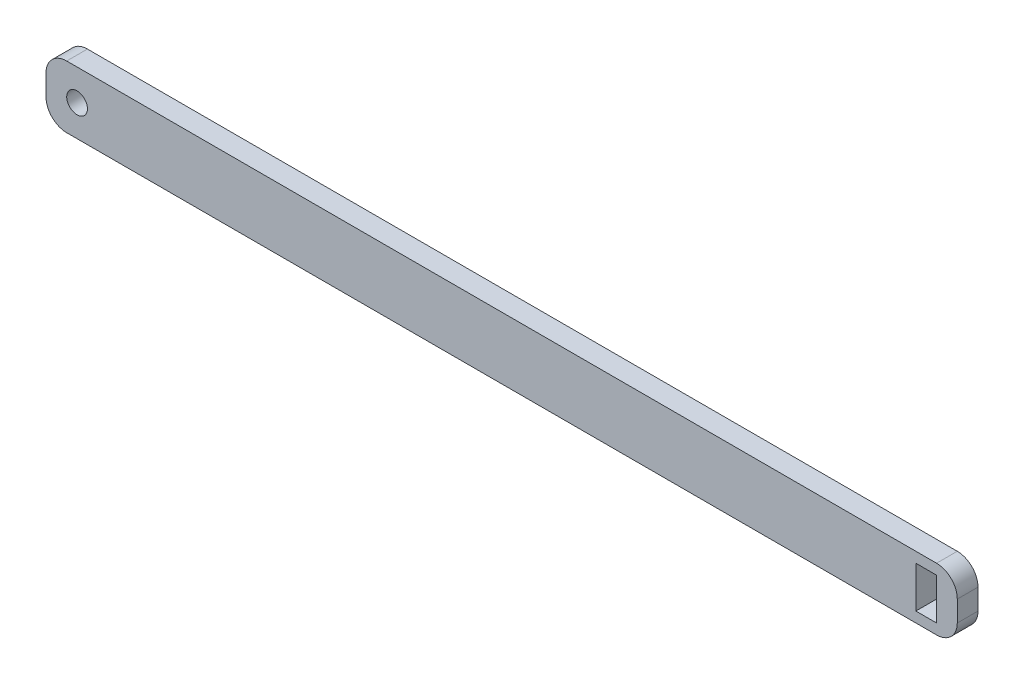
ISO-10303-21;
HEADER;
FILE_DESCRIPTION(('STEP AP214'),'2;1');
FILE_NAME('part.step','',(''),(''),'','','');
FILE_SCHEMA(('AUTOMOTIVE_DESIGN { 1 0 10303 214 1 1 1 1 }'));
ENDSEC;
DATA;
#1=APPLICATION_CONTEXT('core data for automotive mechanical design processes');
#2=APPLICATION_PROTOCOL_DEFINITION('international standard','automotive_design',2000,#1);
#3=PRODUCT_CONTEXT('',#1,'mechanical');
#4=PRODUCT('Part','Part','',(#3));
#5=PRODUCT_RELATED_PRODUCT_CATEGORY('part','',(#4));
#6=PRODUCT_DEFINITION_FORMATION('','',#4);
#7=PRODUCT_DEFINITION_CONTEXT('part definition',#1,'design');
#8=PRODUCT_DEFINITION('design','',#6,#7);
#9=PRODUCT_DEFINITION_SHAPE('','',#8);
#10=(LENGTH_UNIT() NAMED_UNIT(*) SI_UNIT(.MILLI.,.METRE.));
#11=(NAMED_UNIT(*) PLANE_ANGLE_UNIT() SI_UNIT($,.RADIAN.));
#12=(NAMED_UNIT(*) SI_UNIT($,.STERADIAN.) SOLID_ANGLE_UNIT());
#13=UNCERTAINTY_MEASURE_WITH_UNIT(LENGTH_MEASURE(1.E-05),#10,'distance_accuracy_value','');
#14=(GEOMETRIC_REPRESENTATION_CONTEXT(3) GLOBAL_UNCERTAINTY_ASSIGNED_CONTEXT((#13)) GLOBAL_UNIT_ASSIGNED_CONTEXT((#10,
#11,#12)) REPRESENTATION_CONTEXT('',''));
#15=CARTESIAN_POINT('',(0.,0.,0.));
#16=DIRECTION('',(0.,0.,1.));
#17=DIRECTION('',(1.,0.,0.));
#18=AXIS2_PLACEMENT_3D('',#15,#16,#17);
#19=CARTESIAN_POINT('',(-215.,5.,5.));
#20=DIRECTION('',(0.,0.,1.));
#21=DIRECTION('',(1.,0.,0.));
#22=AXIS2_PLACEMENT_3D('',#19,#20,#21);
#23=PLANE('',#22);
#24=DIRECTION('',(1.,0.,0.));
#25=VECTOR('',#24,1.);
#26=CARTESIAN_POINT('',(-10.,2.5,5.));
#27=LINE('',#26,#25);
#28=CARTESIAN_POINT('',(-10.,2.5,5.));
#29=VERTEX_POINT('',#28);
#30=CARTESIAN_POINT('',(-5.00000000000001,2.5,5.));
#31=VERTEX_POINT('',#30);
#32=EDGE_CURVE('E132',#29,#31,#27,.T.);
#33=ORIENTED_EDGE('',*,*,#32,.F.);
#34=DIRECTION('',(0.,-1.,0.));
#35=VECTOR('',#34,1.);
#36=CARTESIAN_POINT('',(-10.,12.5,5.));
#37=LINE('',#36,#35);
#38=CARTESIAN_POINT('',(-10.,12.5,5.));
#39=VERTEX_POINT('',#38);
#40=EDGE_CURVE('E124',#39,#29,#37,.T.);
#41=ORIENTED_EDGE('',*,*,#40,.F.);
#42=DIRECTION('',(-1.,0.,0.));
#43=VECTOR('',#42,1.);
#44=CARTESIAN_POINT('',(-10.,12.5,5.));
#45=LINE('',#44,#43);
#46=CARTESIAN_POINT('',(-5.,12.5,5.));
#47=VERTEX_POINT('',#46);
#48=EDGE_CURVE('E147',#47,#39,#45,.T.);
#49=ORIENTED_EDGE('',*,*,#48,.F.);
#50=DIRECTION('',(0.,1.,0.));
#51=VECTOR('',#50,1.);
#52=CARTESIAN_POINT('',(-5.00000000000001,12.5,5.));
#53=LINE('',#52,#51);
#54=EDGE_CURVE('E145',#31,#47,#53,.T.);
#55=ORIENTED_EDGE('',*,*,#54,.F.);
#56=EDGE_LOOP('',(#33,#41,#49,#55));
#57=FACE_BOUND('',#56,.T.);
#58=CARTESIAN_POINT('',(-215.,5.,5.));
#59=DIRECTION('',(0.,0.,1.));
#60=DIRECTION('',(1.,0.,0.));
#61=AXIS2_PLACEMENT_3D('',#58,#59,#60);
#62=CIRCLE('',#61,5.);
#63=CARTESIAN_POINT('',(-220.,5.00000000000004,5.));
#64=VERTEX_POINT('',#63);
#65=CARTESIAN_POINT('',(-215.,0.,5.));
#66=VERTEX_POINT('',#65);
#67=EDGE_CURVE('E163',#64,#66,#62,.T.);
#68=ORIENTED_EDGE('',*,*,#67,.T.);
#69=DIRECTION('',(1.,0.,0.));
#70=VECTOR('',#69,1.);
#71=CARTESIAN_POINT('',(-215.,0.,5.));
#72=LINE('',#71,#70);
#73=CARTESIAN_POINT('',(-5.00000000000005,0.,5.));
#74=VERTEX_POINT('',#73);
#75=EDGE_CURVE('E166',#66,#74,#72,.T.);
#76=ORIENTED_EDGE('',*,*,#75,.T.);
#77=CARTESIAN_POINT('',(-5.00000000000001,5.,5.));
#78=DIRECTION('',(0.,0.,1.));
#79=DIRECTION('',(1.,0.,0.));
#80=AXIS2_PLACEMENT_3D('',#77,#78,#79);
#81=CIRCLE('',#80,5.);
#82=CARTESIAN_POINT('',(0.,5.00000000000004,5.));
#83=VERTEX_POINT('',#82);
#84=EDGE_CURVE('E169',#74,#83,#81,.T.);
#85=ORIENTED_EDGE('',*,*,#84,.T.);
#86=DIRECTION('',(0.,1.,0.));
#87=VECTOR('',#86,1.);
#88=CARTESIAN_POINT('',(0.,10.,5.));
#89=LINE('',#88,#87);
#90=CARTESIAN_POINT('',(0.,10.,5.));
#91=VERTEX_POINT('',#90);
#92=EDGE_CURVE('E171',#83,#91,#89,.T.);
#93=ORIENTED_EDGE('',*,*,#92,.T.);
#94=CARTESIAN_POINT('',(-5.00000000000002,10.,5.));
#95=DIRECTION('',(0.,0.,1.));
#96=DIRECTION('',(-1.,0.,0.));
#97=AXIS2_PLACEMENT_3D('',#94,#95,#96);
#98=CIRCLE('',#97,5.);
#99=CARTESIAN_POINT('',(-5.00000000000005,15.,5.));
#100=VERTEX_POINT('',#99);
#101=EDGE_CURVE('E173',#91,#100,#98,.T.);
#102=ORIENTED_EDGE('',*,*,#101,.T.);
#103=DIRECTION('',(-1.,0.,0.));
#104=VECTOR('',#103,1.);
#105=CARTESIAN_POINT('',(-215.,15.,5.));
#106=LINE('',#105,#104);
#107=CARTESIAN_POINT('',(-215.,15.,5.));
#108=VERTEX_POINT('',#107);
#109=EDGE_CURVE('E175',#100,#108,#106,.T.);
#110=ORIENTED_EDGE('',*,*,#109,.T.);
#111=CARTESIAN_POINT('',(-215.,10.,5.));
#112=DIRECTION('',(0.,0.,1.));
#113=DIRECTION('',(1.,0.,0.));
#114=AXIS2_PLACEMENT_3D('',#111,#112,#113);
#115=CIRCLE('',#114,5.);
#116=CARTESIAN_POINT('',(-220.,9.99999999999996,5.));
#117=VERTEX_POINT('',#116);
#118=EDGE_CURVE('E177',#108,#117,#115,.T.);
#119=ORIENTED_EDGE('',*,*,#118,.T.);
#120=DIRECTION('',(0.,-1.,0.));
#121=VECTOR('',#120,1.);
#122=CARTESIAN_POINT('',(-220.,9.99999999999996,5.));
#123=LINE('',#122,#121);
#124=EDGE_CURVE('E179',#117,#64,#123,.T.);
#125=ORIENTED_EDGE('',*,*,#124,.T.);
#126=EDGE_LOOP('',(#68,#76,#85,#93,#102,#110,#119,#125));
#127=FACE_BOUND('',#126,.T.);
#128=CARTESIAN_POINT('',(-212.5,7.5,5.));
#129=DIRECTION('',(0.,0.,1.));
#130=DIRECTION('',(1.,0.,0.));
#131=AXIS2_PLACEMENT_3D('',#128,#129,#130);
#132=CIRCLE('',#131,2.5);
#133=CARTESIAN_POINT('',(-210.,7.5,5.));
#134=VERTEX_POINT('',#133);
#135=EDGE_CURVE('E153',#134,#134,#132,.T.);
#136=ORIENTED_EDGE('',*,*,#135,.F.);
#137=EDGE_LOOP('',(#136));
#138=FACE_BOUND('',#137,.T.);
#139=ADVANCED_FACE('F35',(#57,#127,#138),#23,.T.);
#140=CARTESIAN_POINT('',(-215.,5.,0.));
#141=DIRECTION('',(0.,0.,1.));
#142=DIRECTION('',(1.,0.,0.));
#143=AXIS2_PLACEMENT_3D('',#140,#141,#142);
#144=PLANE('',#143);
#145=CARTESIAN_POINT('',(-215.,5.,0.));
#146=DIRECTION('',(0.,0.,1.));
#147=DIRECTION('',(1.,0.,0.));
#148=AXIS2_PLACEMENT_3D('',#145,#146,#147);
#149=CIRCLE('',#148,5.);
#150=CARTESIAN_POINT('',(-220.,5.00000000000004,0.));
#151=VERTEX_POINT('',#150);
#152=CARTESIAN_POINT('',(-215.,0.,0.));
#153=VERTEX_POINT('',#152);
#154=EDGE_CURVE('E140',#151,#153,#149,.T.);
#155=ORIENTED_EDGE('',*,*,#154,.F.);
#156=DIRECTION('',(0.,-1.,0.));
#157=VECTOR('',#156,1.);
#158=CARTESIAN_POINT('',(-220.,9.99999999999996,0.));
#159=LINE('',#158,#157);
#160=CARTESIAN_POINT('',(-220.,9.99999999999996,0.));
#161=VERTEX_POINT('',#160);
#162=EDGE_CURVE('E167',#161,#151,#159,.T.);
#163=ORIENTED_EDGE('',*,*,#162,.F.);
#164=CARTESIAN_POINT('',(-215.,10.,0.));
#165=DIRECTION('',(0.,0.,1.));
#166=DIRECTION('',(1.,0.,0.));
#167=AXIS2_PLACEMENT_3D('',#164,#165,#166);
#168=CIRCLE('',#167,5.);
#169=CARTESIAN_POINT('',(-215.,15.,0.));
#170=VERTEX_POINT('',#169);
#171=EDGE_CURVE('E194',#170,#161,#168,.T.);
#172=ORIENTED_EDGE('',*,*,#171,.F.);
#173=DIRECTION('',(-1.,0.,0.));
#174=VECTOR('',#173,1.);
#175=CARTESIAN_POINT('',(-215.,15.,0.));
#176=LINE('',#175,#174);
#177=CARTESIAN_POINT('',(-5.00000000000005,15.,0.));
#178=VERTEX_POINT('',#177);
#179=EDGE_CURVE('E192',#178,#170,#176,.T.);
#180=ORIENTED_EDGE('',*,*,#179,.F.);
#181=CARTESIAN_POINT('',(-5.00000000000002,10.,0.));
#182=DIRECTION('',(0.,0.,1.));
#183=DIRECTION('',(-1.,0.,0.));
#184=AXIS2_PLACEMENT_3D('',#181,#182,#183);
#185=CIRCLE('',#184,5.);
#186=CARTESIAN_POINT('',(0.,10.,0.));
#187=VERTEX_POINT('',#186);
#188=EDGE_CURVE('E190',#187,#178,#185,.T.);
#189=ORIENTED_EDGE('',*,*,#188,.F.);
#190=DIRECTION('',(0.,1.,0.));
#191=VECTOR('',#190,1.);
#192=CARTESIAN_POINT('',(0.,10.,0.));
#193=LINE('',#192,#191);
#194=CARTESIAN_POINT('',(0.,5.00000000000004,0.));
#195=VERTEX_POINT('',#194);
#196=EDGE_CURVE('E188',#195,#187,#193,.T.);
#197=ORIENTED_EDGE('',*,*,#196,.F.);
#198=CARTESIAN_POINT('',(-5.00000000000001,5.,0.));
#199=DIRECTION('',(0.,0.,1.));
#200=DIRECTION('',(1.,0.,0.));
#201=AXIS2_PLACEMENT_3D('',#198,#199,#200);
#202=CIRCLE('',#201,5.);
#203=CARTESIAN_POINT('',(-5.00000000000005,0.,0.));
#204=VERTEX_POINT('',#203);
#205=EDGE_CURVE('E186',#204,#195,#202,.T.);
#206=ORIENTED_EDGE('',*,*,#205,.F.);
#207=DIRECTION('',(1.,0.,0.));
#208=VECTOR('',#207,1.);
#209=CARTESIAN_POINT('',(-215.,0.,0.));
#210=LINE('',#209,#208);
#211=EDGE_CURVE('E184',#153,#204,#210,.T.);
#212=ORIENTED_EDGE('',*,*,#211,.F.);
#213=EDGE_LOOP('',(#155,#163,#172,#180,#189,#197,#206,#212));
#214=FACE_BOUND('',#213,.T.);
#215=DIRECTION('',(0.,-1.,0.));
#216=VECTOR('',#215,1.);
#217=CARTESIAN_POINT('',(-10.,12.5,0.));
#218=LINE('',#217,#216);
#219=CARTESIAN_POINT('',(-10.,12.5,0.));
#220=VERTEX_POINT('',#219);
#221=CARTESIAN_POINT('',(-10.,2.5,0.));
#222=VERTEX_POINT('',#221);
#223=EDGE_CURVE('E58',#220,#222,#218,.T.);
#224=ORIENTED_EDGE('',*,*,#223,.T.);
#225=DIRECTION('',(1.,0.,0.));
#226=VECTOR('',#225,1.);
#227=CARTESIAN_POINT('',(-10.,2.5,0.));
#228=LINE('',#227,#226);
#229=CARTESIAN_POINT('',(-5.00000000000001,2.5,0.));
#230=VERTEX_POINT('',#229);
#231=EDGE_CURVE('E139',#222,#230,#228,.T.);
#232=ORIENTED_EDGE('',*,*,#231,.T.);
#233=DIRECTION('',(0.,1.,0.));
#234=VECTOR('',#233,1.);
#235=CARTESIAN_POINT('',(-5.00000000000001,12.5,0.));
#236=LINE('',#235,#234);
#237=CARTESIAN_POINT('',(-5.00000000000001,12.5,0.));
#238=VERTEX_POINT('',#237);
#239=EDGE_CURVE('E155',#230,#238,#236,.T.);
#240=ORIENTED_EDGE('',*,*,#239,.T.);
#241=DIRECTION('',(-1.,0.,0.));
#242=VECTOR('',#241,1.);
#243=CARTESIAN_POINT('',(-10.,12.5,0.));
#244=LINE('',#243,#242);
#245=EDGE_CURVE('E133',#238,#220,#244,.T.);
#246=ORIENTED_EDGE('',*,*,#245,.T.);
#247=EDGE_LOOP('',(#224,#232,#240,#246));
#248=FACE_BOUND('',#247,.T.);
#249=CARTESIAN_POINT('',(-212.5,7.5,0.));
#250=DIRECTION('',(0.,0.,1.));
#251=DIRECTION('',(1.,0.,0.));
#252=AXIS2_PLACEMENT_3D('',#249,#250,#251);
#253=CIRCLE('',#252,2.5);
#254=CARTESIAN_POINT('',(-210.,7.5,0.));
#255=VERTEX_POINT('',#254);
#256=EDGE_CURVE('E299',#255,#255,#253,.T.);
#257=ORIENTED_EDGE('',*,*,#256,.T.);
#258=EDGE_LOOP('',(#257));
#259=FACE_BOUND('',#258,.T.);
#260=ADVANCED_FACE('F224',(#214,#248,#259),#144,.F.);
#261=CARTESIAN_POINT('',(-215.,5.,5.));
#262=DIRECTION('',(0.,0.,-1.));
#263=DIRECTION('',(-1.,0.,0.));
#264=AXIS2_PLACEMENT_3D('',#261,#262,#263);
#265=CYLINDRICAL_SURFACE('',#264,5.);
#266=ORIENTED_EDGE('',*,*,#154,.T.);
#267=DIRECTION('',(0.,0.,-1.));
#268=VECTOR('',#267,1.);
#269=CARTESIAN_POINT('',(-215.,0.,5.));
#270=LINE('',#269,#268);
#271=EDGE_CURVE('E11',#66,#153,#270,.T.);
#272=ORIENTED_EDGE('',*,*,#271,.F.);
#273=ORIENTED_EDGE('',*,*,#67,.F.);
#274=DIRECTION('',(0.,0.,-1.));
#275=VECTOR('',#274,1.);
#276=CARTESIAN_POINT('',(-220.,5.00000000000004,5.));
#277=LINE('',#276,#275);
#278=EDGE_CURVE('E181',#64,#151,#277,.T.);
#279=ORIENTED_EDGE('',*,*,#278,.T.);
#280=EDGE_LOOP('',(#266,#272,#273,#279));
#281=FACE_BOUND('',#280,.T.);
#282=ADVANCED_FACE('F37',(#281),#265,.T.);
#283=CARTESIAN_POINT('',(-215.,0.,5.));
#284=DIRECTION('',(0.,1.,0.));
#285=DIRECTION('',(0.,0.,1.));
#286=AXIS2_PLACEMENT_3D('',#283,#284,#285);
#287=PLANE('',#286);
#288=ORIENTED_EDGE('',*,*,#211,.T.);
#289=DIRECTION('',(0.,0.,-1.));
#290=VECTOR('',#289,1.);
#291=CARTESIAN_POINT('',(-5.00000000000005,0.,5.));
#292=LINE('',#291,#290);
#293=EDGE_CURVE('E43',#74,#204,#292,.T.);
#294=ORIENTED_EDGE('',*,*,#293,.F.);
#295=ORIENTED_EDGE('',*,*,#75,.F.);
#296=ORIENTED_EDGE('',*,*,#271,.T.);
#297=EDGE_LOOP('',(#288,#294,#295,#296));
#298=FACE_BOUND('',#297,.T.);
#299=ADVANCED_FACE('F241',(#298),#287,.F.);
#300=CARTESIAN_POINT('',(-5.00000000000001,5.,5.));
#301=DIRECTION('',(0.,0.,-1.));
#302=DIRECTION('',(-1.,0.,0.));
#303=AXIS2_PLACEMENT_3D('',#300,#301,#302);
#304=CYLINDRICAL_SURFACE('',#303,5.);
#305=ORIENTED_EDGE('',*,*,#205,.T.);
#306=DIRECTION('',(0.,0.,-1.));
#307=VECTOR('',#306,1.);
#308=CARTESIAN_POINT('',(0.,5.00000000000004,5.));
#309=LINE('',#308,#307);
#310=EDGE_CURVE('E211',#83,#195,#309,.T.);
#311=ORIENTED_EDGE('',*,*,#310,.F.);
#312=ORIENTED_EDGE('',*,*,#84,.F.);
#313=ORIENTED_EDGE('',*,*,#293,.T.);
#314=EDGE_LOOP('',(#305,#311,#312,#313));
#315=FACE_BOUND('',#314,.T.);
#316=ADVANCED_FACE('F218',(#315),#304,.T.);
#317=CARTESIAN_POINT('',(0.,10.,5.));
#318=DIRECTION('',(-1.,0.,0.));
#319=DIRECTION('',(0.,-1.,0.));
#320=AXIS2_PLACEMENT_3D('',#317,#318,#319);
#321=PLANE('',#320);
#322=ORIENTED_EDGE('',*,*,#196,.T.);
#323=DIRECTION('',(0.,0.,-1.));
#324=VECTOR('',#323,1.);
#325=CARTESIAN_POINT('',(0.,10.,5.));
#326=LINE('',#325,#324);
#327=EDGE_CURVE('E208',#91,#187,#326,.T.);
#328=ORIENTED_EDGE('',*,*,#327,.F.);
#329=ORIENTED_EDGE('',*,*,#92,.F.);
#330=ORIENTED_EDGE('',*,*,#310,.T.);
#331=EDGE_LOOP('',(#322,#328,#329,#330));
#332=FACE_BOUND('',#331,.T.);
#333=ADVANCED_FACE('F230',(#332),#321,.F.);
#334=CARTESIAN_POINT('',(-5.00000000000002,10.,5.));
#335=DIRECTION('',(0.,0.,-1.));
#336=DIRECTION('',(-1.,0.,0.));
#337=AXIS2_PLACEMENT_3D('',#334,#335,#336);
#338=CYLINDRICAL_SURFACE('',#337,5.);
#339=ORIENTED_EDGE('',*,*,#188,.T.);
#340=DIRECTION('',(0.,0.,-1.));
#341=VECTOR('',#340,1.);
#342=CARTESIAN_POINT('',(-5.00000000000005,15.,5.));
#343=LINE('',#342,#341);
#344=EDGE_CURVE('E205',#100,#178,#343,.T.);
#345=ORIENTED_EDGE('',*,*,#344,.F.);
#346=ORIENTED_EDGE('',*,*,#101,.F.);
#347=ORIENTED_EDGE('',*,*,#327,.T.);
#348=EDGE_LOOP('',(#339,#345,#346,#347));
#349=FACE_BOUND('',#348,.T.);
#350=ADVANCED_FACE('F234',(#349),#338,.T.);
#351=CARTESIAN_POINT('',(-215.,15.,5.));
#352=DIRECTION('',(0.,-1.,0.));
#353=DIRECTION('',(1.,0.,0.));
#354=AXIS2_PLACEMENT_3D('',#351,#352,#353);
#355=PLANE('',#354);
#356=ORIENTED_EDGE('',*,*,#179,.T.);
#357=DIRECTION('',(0.,0.,-1.));
#358=VECTOR('',#357,1.);
#359=CARTESIAN_POINT('',(-215.,15.,5.));
#360=LINE('',#359,#358);
#361=EDGE_CURVE('E202',#108,#170,#360,.T.);
#362=ORIENTED_EDGE('',*,*,#361,.F.);
#363=ORIENTED_EDGE('',*,*,#109,.F.);
#364=ORIENTED_EDGE('',*,*,#344,.T.);
#365=EDGE_LOOP('',(#356,#362,#363,#364));
#366=FACE_BOUND('',#365,.T.);
#367=ADVANCED_FACE('F254',(#366),#355,.F.);
#368=CARTESIAN_POINT('',(-215.,10.,5.));
#369=DIRECTION('',(0.,0.,-1.));
#370=DIRECTION('',(-1.,0.,0.));
#371=AXIS2_PLACEMENT_3D('',#368,#369,#370);
#372=CYLINDRICAL_SURFACE('',#371,5.);
#373=ORIENTED_EDGE('',*,*,#171,.T.);
#374=DIRECTION('',(0.,0.,-1.));
#375=VECTOR('',#374,1.);
#376=CARTESIAN_POINT('',(-220.,9.99999999999996,5.));
#377=LINE('',#376,#375);
#378=EDGE_CURVE('E199',#117,#161,#377,.T.);
#379=ORIENTED_EDGE('',*,*,#378,.F.);
#380=ORIENTED_EDGE('',*,*,#118,.F.);
#381=ORIENTED_EDGE('',*,*,#361,.T.);
#382=EDGE_LOOP('',(#373,#379,#380,#381));
#383=FACE_BOUND('',#382,.T.);
#384=ADVANCED_FACE('F252',(#383),#372,.T.);
#385=CARTESIAN_POINT('',(-220.,9.99999999999996,5.));
#386=DIRECTION('',(1.,0.,0.));
#387=DIRECTION('',(0.,0.,-1.));
#388=AXIS2_PLACEMENT_3D('',#385,#386,#387);
#389=PLANE('',#388);
#390=ORIENTED_EDGE('',*,*,#162,.T.);
#391=ORIENTED_EDGE('',*,*,#278,.F.);
#392=ORIENTED_EDGE('',*,*,#124,.F.);
#393=ORIENTED_EDGE('',*,*,#378,.T.);
#394=EDGE_LOOP('',(#390,#391,#392,#393));
#395=FACE_BOUND('',#394,.T.);
#396=ADVANCED_FACE('F247',(#395),#389,.F.);
#397=CARTESIAN_POINT('',(-10.,12.5,5.));
#398=DIRECTION('',(1.,0.,0.));
#399=DIRECTION('',(0.,1.,0.));
#400=AXIS2_PLACEMENT_3D('',#397,#398,#399);
#401=PLANE('',#400);
#402=ORIENTED_EDGE('',*,*,#223,.F.);
#403=DIRECTION('',(0.,0.,-1.));
#404=VECTOR('',#403,1.);
#405=CARTESIAN_POINT('',(-10.,12.5,5.));
#406=LINE('',#405,#404);
#407=EDGE_CURVE('E128',#39,#220,#406,.T.);
#408=ORIENTED_EDGE('',*,*,#407,.F.);
#409=ORIENTED_EDGE('',*,*,#40,.T.);
#410=DIRECTION('',(0.,0.,-1.));
#411=VECTOR('',#410,1.);
#412=CARTESIAN_POINT('',(-10.,2.5,5.));
#413=LINE('',#412,#411);
#414=EDGE_CURVE('E127',#29,#222,#413,.T.);
#415=ORIENTED_EDGE('',*,*,#414,.T.);
#416=EDGE_LOOP('',(#402,#408,#409,#415));
#417=FACE_BOUND('',#416,.T.);
#418=ADVANCED_FACE('F126',(#417),#401,.T.);
#419=CARTESIAN_POINT('',(-10.,2.5,5.));
#420=DIRECTION('',(0.,1.,0.));
#421=DIRECTION('',(0.,0.,1.));
#422=AXIS2_PLACEMENT_3D('',#419,#420,#421);
#423=PLANE('',#422);
#424=ORIENTED_EDGE('',*,*,#231,.F.);
#425=ORIENTED_EDGE('',*,*,#414,.F.);
#426=ORIENTED_EDGE('',*,*,#32,.T.);
#427=DIRECTION('',(0.,0.,-1.));
#428=VECTOR('',#427,1.);
#429=CARTESIAN_POINT('',(-5.00000000000001,2.5,5.));
#430=LINE('',#429,#428);
#431=EDGE_CURVE('E141',#31,#230,#430,.T.);
#432=ORIENTED_EDGE('',*,*,#431,.T.);
#433=EDGE_LOOP('',(#424,#425,#426,#432));
#434=FACE_BOUND('',#433,.T.);
#435=ADVANCED_FACE('F136',(#434),#423,.T.);
#436=CARTESIAN_POINT('',(-5.00000000000001,12.5,5.));
#437=DIRECTION('',(-1.,0.,0.));
#438=DIRECTION('',(0.,-1.,0.));
#439=AXIS2_PLACEMENT_3D('',#436,#437,#438);
#440=PLANE('',#439);
#441=ORIENTED_EDGE('',*,*,#239,.F.);
#442=ORIENTED_EDGE('',*,*,#431,.F.);
#443=ORIENTED_EDGE('',*,*,#54,.T.);
#444=DIRECTION('',(0.,0.,-1.));
#445=VECTOR('',#444,1.);
#446=CARTESIAN_POINT('',(-5.00000000000001,12.5,5.));
#447=LINE('',#446,#445);
#448=EDGE_CURVE('E50',#47,#238,#447,.T.);
#449=ORIENTED_EDGE('',*,*,#448,.T.);
#450=EDGE_LOOP('',(#441,#442,#443,#449));
#451=FACE_BOUND('',#450,.T.);
#452=ADVANCED_FACE('F279',(#451),#440,.T.);
#453=CARTESIAN_POINT('',(-10.,12.5,5.));
#454=DIRECTION('',(0.,-1.,0.));
#455=DIRECTION('',(0.,0.,-1.));
#456=AXIS2_PLACEMENT_3D('',#453,#454,#455);
#457=PLANE('',#456);
#458=ORIENTED_EDGE('',*,*,#245,.F.);
#459=ORIENTED_EDGE('',*,*,#448,.F.);
#460=ORIENTED_EDGE('',*,*,#48,.T.);
#461=ORIENTED_EDGE('',*,*,#407,.T.);
#462=EDGE_LOOP('',(#458,#459,#460,#461));
#463=FACE_BOUND('',#462,.T.);
#464=ADVANCED_FACE('F283',(#463),#457,.T.);
#465=CARTESIAN_POINT('',(-212.5,7.5,5.));
#466=DIRECTION('',(0.,0.,-1.));
#467=DIRECTION('',(-1.,0.,0.));
#468=AXIS2_PLACEMENT_3D('',#465,#466,#467);
#469=CYLINDRICAL_SURFACE('',#468,2.5);
#470=ORIENTED_EDGE('',*,*,#135,.T.);
#471=EDGE_LOOP('',(#470));
#472=FACE_BOUND('',#471,.T.);
#473=ORIENTED_EDGE('',*,*,#256,.F.);
#474=EDGE_LOOP('',(#473));
#475=FACE_BOUND('',#474,.T.);
#476=ADVANCED_FACE('F289',(#472,#475),#469,.F.);
#477=CLOSED_SHELL('',(#139,#260,#282,#299,#316,#333,#350,#367,#384,#396,#418,#435,#452,#464,#476));
#478=MANIFOLD_SOLID_BREP('B2',#477);
#479=ADVANCED_BREP_SHAPE_REPRESENTATION('',(#18,#478),#14);
#480=SHAPE_DEFINITION_REPRESENTATION(#9,#479);
ENDSEC;
END-ISO-10303-21;
